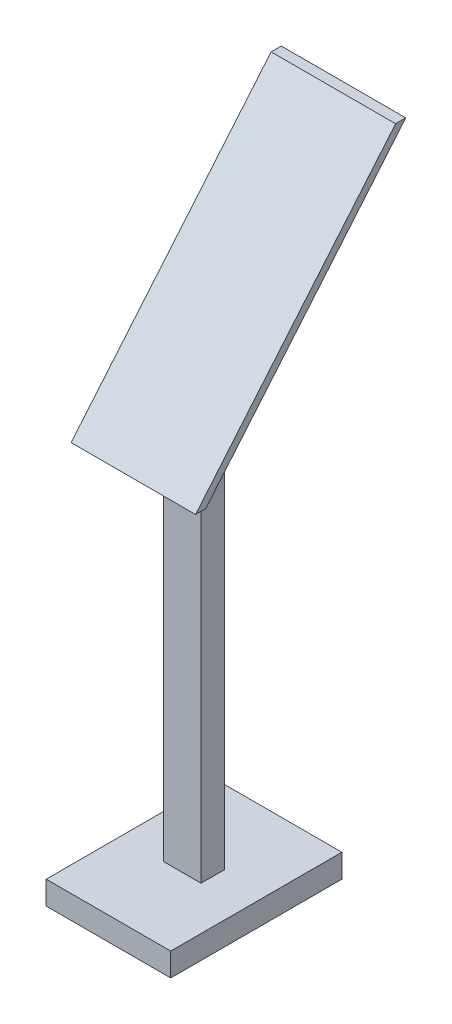
ISO-10303-21;
HEADER;
FILE_DESCRIPTION(('STEP AP214'),'2;1');
FILE_NAME('part.step','',(''),(''),'','','');
FILE_SCHEMA(('AUTOMOTIVE_DESIGN { 1 0 10303 214 1 1 1 1 }'));
ENDSEC;
DATA;
#1=APPLICATION_CONTEXT('core data for automotive mechanical design processes');
#2=APPLICATION_PROTOCOL_DEFINITION('international standard','automotive_design',2000,#1);
#3=PRODUCT_CONTEXT('',#1,'mechanical');
#4=PRODUCT('Part','Part','',(#3));
#5=PRODUCT_RELATED_PRODUCT_CATEGORY('part','',(#4));
#6=PRODUCT_DEFINITION_FORMATION('','',#4);
#7=PRODUCT_DEFINITION_CONTEXT('part definition',#1,'design');
#8=PRODUCT_DEFINITION('design','',#6,#7);
#9=PRODUCT_DEFINITION_SHAPE('','',#8);
#10=(LENGTH_UNIT() NAMED_UNIT(*) SI_UNIT(.MILLI.,.METRE.));
#11=(NAMED_UNIT(*) PLANE_ANGLE_UNIT() SI_UNIT($,.RADIAN.));
#12=(NAMED_UNIT(*) SI_UNIT($,.STERADIAN.) SOLID_ANGLE_UNIT());
#13=UNCERTAINTY_MEASURE_WITH_UNIT(LENGTH_MEASURE(1.E-05),#10,'distance_accuracy_value','');
#14=(GEOMETRIC_REPRESENTATION_CONTEXT(3) GLOBAL_UNCERTAINTY_ASSIGNED_CONTEXT((#13)) GLOBAL_UNIT_ASSIGNED_CONTEXT((#10,
#11,#12)) REPRESENTATION_CONTEXT('',''));
#15=CARTESIAN_POINT('',(0.,0.,0.));
#16=DIRECTION('',(0.,0.,1.));
#17=DIRECTION('',(1.,0.,0.));
#18=AXIS2_PLACEMENT_3D('',#15,#16,#17);
#19=CARTESIAN_POINT('',(-40.,0.,0.));
#20=DIRECTION('',(1.,0.,0.));
#21=DIRECTION('',(0.,0.,-1.));
#22=AXIS2_PLACEMENT_3D('',#19,#20,#21);
#23=PLANE('',#22);
#24=DIRECTION('',(0.,-1.,0.));
#25=VECTOR('',#24,1.);
#26=CARTESIAN_POINT('',(-40.,0.,55.));
#27=LINE('',#26,#25);
#28=CARTESIAN_POINT('',(-40.,15.,55.));
#29=VERTEX_POINT('',#28);
#30=CARTESIAN_POINT('',(-40.,0.,55.));
#31=VERTEX_POINT('',#30);
#32=EDGE_CURVE('E140',#29,#31,#27,.T.);
#33=ORIENTED_EDGE('',*,*,#32,.F.);
#34=DIRECTION('',(0.,0.,1.));
#35=VECTOR('',#34,1.);
#36=CARTESIAN_POINT('',(-40.,15.,-55.));
#37=LINE('',#36,#35);
#38=CARTESIAN_POINT('',(-40.,15.,-55.));
#39=VERTEX_POINT('',#38);
#40=EDGE_CURVE('E147',#39,#29,#37,.T.);
#41=ORIENTED_EDGE('',*,*,#40,.F.);
#42=DIRECTION('',(0.,1.,0.));
#43=VECTOR('',#42,1.);
#44=CARTESIAN_POINT('',(-40.,0.,-55.));
#45=LINE('',#44,#43);
#46=CARTESIAN_POINT('',(-40.,0.,-55.));
#47=VERTEX_POINT('',#46);
#48=EDGE_CURVE('E145',#47,#39,#45,.T.);
#49=ORIENTED_EDGE('',*,*,#48,.F.);
#50=DIRECTION('',(0.,0.,-1.));
#51=VECTOR('',#50,1.);
#52=CARTESIAN_POINT('',(-40.,0.,-55.));
#53=LINE('',#52,#51);
#54=EDGE_CURVE('E142',#31,#47,#53,.T.);
#55=ORIENTED_EDGE('',*,*,#54,.F.);
#56=EDGE_LOOP('',(#33,#41,#49,#55));
#57=FACE_BOUND('',#56,.T.);
#58=ADVANCED_FACE('F39',(#57),#23,.F.);
#59=DIRECTION('',(0.,0.,1.));
#60=VECTOR('',#59,1.);
#61=CARTESIAN_POINT('',(-40.,403.208888623795,-89.5304854906467));
#62=LINE('',#61,#60);
#63=CARTESIAN_POINT('',(-40.,403.208888623795,-96.0575219373081));
#64=VERTEX_POINT('',#63);
#65=CARTESIAN_POINT('',(-40.,403.208888623795,-89.5304854906467));
#66=VERTEX_POINT('',#65);
#67=EDGE_CURVE('E128',#64,#66,#62,.T.);
#68=ORIENTED_EDGE('',*,*,#67,.F.);
#69=DIRECTION('',(0.,0.766044443118977,-0.64278760968654));
#70=VECTOR('',#69,1.);
#71=CARTESIAN_POINT('',(-40.,250.,32.5));
#72=LINE('',#71,#70);
#73=CARTESIAN_POINT('',(-40.,250.,32.5));
#74=VERTEX_POINT('',#73);
#75=EDGE_CURVE('E152',#74,#64,#72,.T.);
#76=ORIENTED_EDGE('',*,*,#75,.F.);
#77=DIRECTION('',(0.,0.,-1.));
#78=VECTOR('',#77,1.);
#79=CARTESIAN_POINT('',(-40.,250.,39.0270364466614));
#80=LINE('',#79,#78);
#81=CARTESIAN_POINT('',(-40.,250.,39.0270364466614));
#82=VERTEX_POINT('',#81);
#83=EDGE_CURVE('E94',#82,#74,#80,.T.);
#84=ORIENTED_EDGE('',*,*,#83,.F.);
#85=DIRECTION('',(0.,-0.766044443118977,0.64278760968654));
#86=VECTOR('',#85,1.);
#87=CARTESIAN_POINT('',(-40.,403.208888623795,-89.5304854906467));
#88=LINE('',#87,#86);
#89=EDGE_CURVE('E87',#66,#82,#88,.T.);
#90=ORIENTED_EDGE('',*,*,#89,.F.);
#91=EDGE_LOOP('',(#68,#76,#84,#90));
#92=FACE_BOUND('',#91,.T.);
#93=ADVANCED_FACE('F269',(#92),#23,.F.);
#94=CARTESIAN_POINT('',(40.,0.,0.));
#95=DIRECTION('',(1.,0.,0.));
#96=DIRECTION('',(0.,0.,-1.));
#97=AXIS2_PLACEMENT_3D('',#94,#95,#96);
#98=PLANE('',#97);
#99=DIRECTION('',(0.,0.,-1.));
#100=VECTOR('',#99,1.);
#101=CARTESIAN_POINT('',(40.,250.,39.0270364466614));
#102=LINE('',#101,#100);
#103=CARTESIAN_POINT('',(40.,250.,39.0270364466614));
#104=VERTEX_POINT('',#103);
#105=CARTESIAN_POINT('',(40.,250.,32.5));
#106=VERTEX_POINT('',#105);
#107=EDGE_CURVE('E134',#104,#106,#102,.T.);
#108=ORIENTED_EDGE('',*,*,#107,.T.);
#109=DIRECTION('',(0.,0.766044443118977,-0.64278760968654));
#110=VECTOR('',#109,1.);
#111=CARTESIAN_POINT('',(40.,297.670143703768,-7.5));
#112=LINE('',#111,#110);
#113=CARTESIAN_POINT('',(40.,403.208888623795,-96.0575219373081));
#114=VERTEX_POINT('',#113);
#115=EDGE_CURVE('E56',#106,#114,#112,.T.);
#116=ORIENTED_EDGE('',*,*,#115,.T.);
#117=DIRECTION('',(0.,0.,1.));
#118=VECTOR('',#117,1.);
#119=CARTESIAN_POINT('',(40.,403.208888623795,-89.5304854906467));
#120=LINE('',#119,#118);
#121=CARTESIAN_POINT('',(40.,403.208888623795,-89.5304854906467));
#122=VERTEX_POINT('',#121);
#123=EDGE_CURVE('E117',#114,#122,#120,.T.);
#124=ORIENTED_EDGE('',*,*,#123,.T.);
#125=DIRECTION('',(0.,-0.766044443118977,0.64278760968654));
#126=VECTOR('',#125,1.);
#127=CARTESIAN_POINT('',(40.,403.208888623795,-89.5304854906467));
#128=LINE('',#127,#126);
#129=EDGE_CURVE('E121',#122,#104,#128,.T.);
#130=ORIENTED_EDGE('',*,*,#129,.T.);
#131=EDGE_LOOP('',(#108,#116,#124,#130));
#132=FACE_BOUND('',#131,.T.);
#133=ADVANCED_FACE('F119',(#132),#98,.T.);
#134=CARTESIAN_POINT('',(40.,0.,55.));
#135=DIRECTION('',(0.,0.,-1.));
#136=DIRECTION('',(0.,1.,0.));
#137=AXIS2_PLACEMENT_3D('',#134,#135,#136);
#138=PLANE('',#137);
#139=ORIENTED_EDGE('',*,*,#32,.T.);
#140=DIRECTION('',(-1.,0.,0.));
#141=VECTOR('',#140,1.);
#142=CARTESIAN_POINT('',(40.,0.,55.));
#143=LINE('',#142,#141);
#144=CARTESIAN_POINT('',(40.,0.,55.));
#145=VERTEX_POINT('',#144);
#146=EDGE_CURVE('E48',#145,#31,#143,.T.);
#147=ORIENTED_EDGE('',*,*,#146,.F.);
#148=DIRECTION('',(0.,-1.,0.));
#149=VECTOR('',#148,1.);
#150=CARTESIAN_POINT('',(40.,0.,55.));
#151=LINE('',#150,#149);
#152=CARTESIAN_POINT('',(40.,15.,55.));
#153=VERTEX_POINT('',#152);
#154=EDGE_CURVE('E101',#153,#145,#151,.T.);
#155=ORIENTED_EDGE('',*,*,#154,.F.);
#156=DIRECTION('',(-1.,0.,0.));
#157=VECTOR('',#156,1.);
#158=CARTESIAN_POINT('',(40.,15.,55.));
#159=LINE('',#158,#157);
#160=EDGE_CURVE('E11',#153,#29,#159,.T.);
#161=ORIENTED_EDGE('',*,*,#160,.T.);
#162=EDGE_LOOP('',(#139,#147,#155,#161));
#163=FACE_BOUND('',#162,.T.);
#164=ADVANCED_FACE('F41',(#163),#138,.F.);
#165=CARTESIAN_POINT('',(40.,0.,-55.));
#166=DIRECTION('',(0.,1.,0.));
#167=DIRECTION('',(0.,0.,1.));
#168=AXIS2_PLACEMENT_3D('',#165,#166,#167);
#169=PLANE('',#168);
#170=ORIENTED_EDGE('',*,*,#54,.T.);
#171=DIRECTION('',(-1.,0.,0.));
#172=VECTOR('',#171,1.);
#173=CARTESIAN_POINT('',(40.,0.,-55.));
#174=LINE('',#173,#172);
#175=CARTESIAN_POINT('',(40.,0.,-55.));
#176=VERTEX_POINT('',#175);
#177=EDGE_CURVE('E173',#176,#47,#174,.T.);
#178=ORIENTED_EDGE('',*,*,#177,.F.);
#179=DIRECTION('',(0.,0.,-1.));
#180=VECTOR('',#179,1.);
#181=CARTESIAN_POINT('',(40.,0.,-55.));
#182=LINE('',#181,#180);
#183=EDGE_CURVE('E181',#145,#176,#182,.T.);
#184=ORIENTED_EDGE('',*,*,#183,.F.);
#185=ORIENTED_EDGE('',*,*,#146,.T.);
#186=EDGE_LOOP('',(#170,#178,#184,#185));
#187=FACE_BOUND('',#186,.T.);
#188=ADVANCED_FACE('F179',(#187),#169,.F.);
#189=CARTESIAN_POINT('',(40.,0.,-55.));
#190=DIRECTION('',(0.,0.,1.));
#191=DIRECTION('',(0.,-1.,0.));
#192=AXIS2_PLACEMENT_3D('',#189,#190,#191);
#193=PLANE('',#192);
#194=ORIENTED_EDGE('',*,*,#48,.T.);
#195=DIRECTION('',(-1.,0.,0.));
#196=VECTOR('',#195,1.);
#197=CARTESIAN_POINT('',(40.,15.,-55.));
#198=LINE('',#197,#196);
#199=CARTESIAN_POINT('',(40.,15.,-55.));
#200=VERTEX_POINT('',#199);
#201=EDGE_CURVE('E170',#200,#39,#198,.T.);
#202=ORIENTED_EDGE('',*,*,#201,.F.);
#203=DIRECTION('',(0.,1.,0.));
#204=VECTOR('',#203,1.);
#205=CARTESIAN_POINT('',(40.,0.,-55.));
#206=LINE('',#205,#204);
#207=EDGE_CURVE('E197',#176,#200,#206,.T.);
#208=ORIENTED_EDGE('',*,*,#207,.F.);
#209=ORIENTED_EDGE('',*,*,#177,.T.);
#210=EDGE_LOOP('',(#194,#202,#208,#209));
#211=FACE_BOUND('',#210,.T.);
#212=ADVANCED_FACE('F188',(#211),#193,.F.);
#213=CARTESIAN_POINT('',(40.,15.,-55.));
#214=DIRECTION('',(0.,-1.,0.));
#215=DIRECTION('',(0.,0.,-1.));
#216=AXIS2_PLACEMENT_3D('',#213,#214,#215);
#217=PLANE('',#216);
#218=ORIENTED_EDGE('',*,*,#40,.T.);
#219=ORIENTED_EDGE('',*,*,#160,.F.);
#220=DIRECTION('',(0.,0.,1.));
#221=VECTOR('',#220,1.);
#222=CARTESIAN_POINT('',(40.,15.,55.));
#223=LINE('',#222,#221);
#224=EDGE_CURVE('E154',#200,#153,#223,.T.);
#225=ORIENTED_EDGE('',*,*,#224,.F.);
#226=ORIENTED_EDGE('',*,*,#201,.T.);
#227=EDGE_LOOP('',(#218,#219,#225,#226));
#228=FACE_BOUND('',#227,.T.);
#229=DIRECTION('',(0.,0.,-1.));
#230=VECTOR('',#229,1.);
#231=CARTESIAN_POINT('',(-12.,15.,-7.5));
#232=LINE('',#231,#230);
#233=CARTESIAN_POINT('',(-12.,15.,7.5));
#234=VERTEX_POINT('',#233);
#235=CARTESIAN_POINT('',(-12.,15.,-7.5));
#236=VERTEX_POINT('',#235);
#237=EDGE_CURVE('E214',#234,#236,#232,.T.);
#238=ORIENTED_EDGE('',*,*,#237,.T.);
#239=DIRECTION('',(-1.,0.,0.));
#240=VECTOR('',#239,1.);
#241=CARTESIAN_POINT('',(40.,15.,-7.5));
#242=LINE('',#241,#240);
#243=CARTESIAN_POINT('',(12.,15.,-7.5));
#244=VERTEX_POINT('',#243);
#245=EDGE_CURVE('E167',#244,#236,#242,.T.);
#246=ORIENTED_EDGE('',*,*,#245,.F.);
#247=DIRECTION('',(0.,0.,-1.));
#248=VECTOR('',#247,1.);
#249=CARTESIAN_POINT('',(12.,15.,-7.5));
#250=LINE('',#249,#248);
#251=CARTESIAN_POINT('',(12.,15.,7.5));
#252=VERTEX_POINT('',#251);
#253=EDGE_CURVE('E208',#252,#244,#250,.T.);
#254=ORIENTED_EDGE('',*,*,#253,.F.);
#255=DIRECTION('',(-1.,0.,0.));
#256=VECTOR('',#255,1.);
#257=CARTESIAN_POINT('',(40.,15.,7.5));
#258=LINE('',#257,#256);
#259=EDGE_CURVE('E136',#252,#234,#258,.T.);
#260=ORIENTED_EDGE('',*,*,#259,.T.);
#261=EDGE_LOOP('',(#238,#246,#254,#260));
#262=FACE_BOUND('',#261,.T.);
#263=ADVANCED_FACE('F191',(#228,#262),#217,.F.);
#264=CARTESIAN_POINT('',(40.,15.,-7.5));
#265=DIRECTION('',(0.,0.,1.));
#266=DIRECTION('',(1.,0.,0.));
#267=AXIS2_PLACEMENT_3D('',#264,#265,#266);
#268=PLANE('',#267);
#269=ORIENTED_EDGE('',*,*,#245,.T.);
#270=DIRECTION('',(0.,1.,0.));
#271=VECTOR('',#270,1.);
#272=CARTESIAN_POINT('',(-12.,297.670143703768,-7.5));
#273=LINE('',#272,#271);
#274=CARTESIAN_POINT('',(-12.,297.670143703768,-7.5));
#275=VERTEX_POINT('',#274);
#276=EDGE_CURVE('E217',#236,#275,#273,.T.);
#277=ORIENTED_EDGE('',*,*,#276,.T.);
#278=DIRECTION('',(-1.,0.,0.));
#279=VECTOR('',#278,1.);
#280=CARTESIAN_POINT('',(40.,297.670143703768,-7.5));
#281=LINE('',#280,#279);
#282=CARTESIAN_POINT('',(12.,297.670143703768,-7.5));
#283=VERTEX_POINT('',#282);
#284=EDGE_CURVE('E164',#283,#275,#281,.T.);
#285=ORIENTED_EDGE('',*,*,#284,.F.);
#286=DIRECTION('',(0.,1.,0.));
#287=VECTOR('',#286,1.);
#288=CARTESIAN_POINT('',(12.,297.670143703768,-7.5));
#289=LINE('',#288,#287);
#290=EDGE_CURVE('E205',#244,#283,#289,.T.);
#291=ORIENTED_EDGE('',*,*,#290,.F.);
#292=EDGE_LOOP('',(#269,#277,#285,#291));
#293=FACE_BOUND('',#292,.T.);
#294=ADVANCED_FACE('F257',(#293),#268,.F.);
#295=CARTESIAN_POINT('',(40.,403.208888623795,-89.5304854906467));
#296=DIRECTION('',(0.,-1.,0.));
#297=DIRECTION('',(0.,0.,-1.));
#298=AXIS2_PLACEMENT_3D('',#295,#296,#297);
#299=PLANE('',#298);
#300=ORIENTED_EDGE('',*,*,#67,.T.);
#301=DIRECTION('',(-1.,0.,0.));
#302=VECTOR('',#301,1.);
#303=CARTESIAN_POINT('',(40.,403.208888623795,-89.5304854906467));
#304=LINE('',#303,#302);
#305=EDGE_CURVE('E125',#122,#66,#304,.T.);
#306=ORIENTED_EDGE('',*,*,#305,.F.);
#307=ORIENTED_EDGE('',*,*,#123,.F.);
#308=DIRECTION('',(-1.,0.,0.));
#309=VECTOR('',#308,1.);
#310=CARTESIAN_POINT('',(40.,403.208888623795,-96.0575219373081));
#311=LINE('',#310,#309);
#312=EDGE_CURVE('E129',#114,#64,#311,.T.);
#313=ORIENTED_EDGE('',*,*,#312,.T.);
#314=EDGE_LOOP('',(#300,#306,#307,#313));
#315=FACE_BOUND('',#314,.T.);
#316=ADVANCED_FACE('F126',(#315),#299,.F.);
#317=CARTESIAN_POINT('',(40.,403.208888623795,-89.5304854906467));
#318=DIRECTION('',(0.,-0.64278760968654,-0.766044443118977));
#319=DIRECTION('',(0.,0.766044443118977,-0.64278760968654));
#320=AXIS2_PLACEMENT_3D('',#317,#318,#319);
#321=PLANE('',#320);
#322=ORIENTED_EDGE('',*,*,#89,.T.);
#323=DIRECTION('',(-1.,0.,0.));
#324=VECTOR('',#323,1.);
#325=CARTESIAN_POINT('',(40.,250.,39.0270364466614));
#326=LINE('',#325,#324);
#327=EDGE_CURVE('E130',#104,#82,#326,.T.);
#328=ORIENTED_EDGE('',*,*,#327,.F.);
#329=ORIENTED_EDGE('',*,*,#129,.F.);
#330=ORIENTED_EDGE('',*,*,#305,.T.);
#331=EDGE_LOOP('',(#322,#328,#329,#330));
#332=FACE_BOUND('',#331,.T.);
#333=ADVANCED_FACE('F132',(#332),#321,.F.);
#334=CARTESIAN_POINT('',(40.,250.,39.0270364466614));
#335=DIRECTION('',(0.,1.,0.));
#336=DIRECTION('',(0.,0.,1.));
#337=AXIS2_PLACEMENT_3D('',#334,#335,#336);
#338=PLANE('',#337);
#339=ORIENTED_EDGE('',*,*,#83,.T.);
#340=DIRECTION('',(-1.,0.,0.));
#341=VECTOR('',#340,1.);
#342=CARTESIAN_POINT('',(40.,250.,32.5));
#343=LINE('',#342,#341);
#344=EDGE_CURVE('E160',#106,#74,#343,.T.);
#345=ORIENTED_EDGE('',*,*,#344,.F.);
#346=ORIENTED_EDGE('',*,*,#107,.F.);
#347=ORIENTED_EDGE('',*,*,#327,.T.);
#348=EDGE_LOOP('',(#339,#345,#346,#347));
#349=FACE_BOUND('',#348,.T.);
#350=ADVANCED_FACE('F282',(#349),#338,.F.);
#351=CARTESIAN_POINT('',(40.,250.,32.5));
#352=DIRECTION('',(0.,0.64278760968654,0.766044443118977));
#353=DIRECTION('',(0.,-0.766044443118977,0.64278760968654));
#354=AXIS2_PLACEMENT_3D('',#351,#352,#353);
#355=PLANE('',#354);
#356=ORIENTED_EDGE('',*,*,#75,.T.);
#357=ORIENTED_EDGE('',*,*,#312,.F.);
#358=ORIENTED_EDGE('',*,*,#115,.F.);
#359=ORIENTED_EDGE('',*,*,#344,.T.);
#360=EDGE_LOOP('',(#356,#357,#358,#359));
#361=FACE_BOUND('',#360,.T.);
#362=ORIENTED_EDGE('',*,*,#284,.T.);
#363=DIRECTION('',(0.,-0.766044443118977,0.642787609686541));
#364=VECTOR('',#363,1.);
#365=CARTESIAN_POINT('',(-12.,279.793839814855,7.5));
#366=LINE('',#365,#364);
#367=CARTESIAN_POINT('',(-12.,279.793839814855,7.5));
#368=VERTEX_POINT('',#367);
#369=EDGE_CURVE('E220',#275,#368,#366,.T.);
#370=ORIENTED_EDGE('',*,*,#369,.T.);
#371=DIRECTION('',(-1.,0.,0.));
#372=VECTOR('',#371,1.);
#373=CARTESIAN_POINT('',(40.,279.793839814855,7.5));
#374=LINE('',#373,#372);
#375=CARTESIAN_POINT('',(12.,279.793839814855,7.5));
#376=VERTEX_POINT('',#375);
#377=EDGE_CURVE('E157',#376,#368,#374,.T.);
#378=ORIENTED_EDGE('',*,*,#377,.F.);
#379=DIRECTION('',(0.,-0.766044443118977,0.642787609686541));
#380=VECTOR('',#379,1.);
#381=CARTESIAN_POINT('',(12.,279.793839814855,7.5));
#382=LINE('',#381,#380);
#383=EDGE_CURVE('E143',#283,#376,#382,.T.);
#384=ORIENTED_EDGE('',*,*,#383,.F.);
#385=EDGE_LOOP('',(#362,#370,#378,#384));
#386=FACE_BOUND('',#385,.T.);
#387=ADVANCED_FACE('F250',(#361,#386),#355,.F.);
#388=CARTESIAN_POINT('',(40.,15.,7.5));
#389=DIRECTION('',(0.,0.,-1.));
#390=DIRECTION('',(-1.,0.,0.));
#391=AXIS2_PLACEMENT_3D('',#388,#389,#390);
#392=PLANE('',#391);
#393=ORIENTED_EDGE('',*,*,#377,.T.);
#394=DIRECTION('',(0.,-1.,0.));
#395=VECTOR('',#394,1.);
#396=CARTESIAN_POINT('',(-12.,279.793839814855,7.5));
#397=LINE('',#396,#395);
#398=EDGE_CURVE('E223',#368,#234,#397,.T.);
#399=ORIENTED_EDGE('',*,*,#398,.T.);
#400=ORIENTED_EDGE('',*,*,#259,.F.);
#401=DIRECTION('',(0.,-1.,0.));
#402=VECTOR('',#401,1.);
#403=CARTESIAN_POINT('',(12.,279.793839814855,7.5));
#404=LINE('',#403,#402);
#405=EDGE_CURVE('E211',#376,#252,#404,.T.);
#406=ORIENTED_EDGE('',*,*,#405,.F.);
#407=EDGE_LOOP('',(#393,#399,#400,#406));
#408=FACE_BOUND('',#407,.T.);
#409=ADVANCED_FACE('F229',(#408),#392,.F.);
#410=ORIENTED_EDGE('',*,*,#207,.T.);
#411=ORIENTED_EDGE('',*,*,#224,.T.);
#412=ORIENTED_EDGE('',*,*,#154,.T.);
#413=ORIENTED_EDGE('',*,*,#183,.T.);
#414=EDGE_LOOP('',(#410,#411,#412,#413));
#415=FACE_BOUND('',#414,.T.);
#416=ADVANCED_FACE('F198',(#415),#98,.T.);
#417=CARTESIAN_POINT('',(12.,0.,0.));
#418=DIRECTION('',(-1.,0.,0.));
#419=DIRECTION('',(0.,0.,1.));
#420=AXIS2_PLACEMENT_3D('',#417,#418,#419);
#421=PLANE('',#420);
#422=ORIENTED_EDGE('',*,*,#405,.T.);
#423=ORIENTED_EDGE('',*,*,#253,.T.);
#424=ORIENTED_EDGE('',*,*,#290,.T.);
#425=ORIENTED_EDGE('',*,*,#383,.T.);
#426=EDGE_LOOP('',(#422,#423,#424,#425));
#427=FACE_BOUND('',#426,.T.);
#428=ADVANCED_FACE('F246',(#427),#421,.F.);
#429=CARTESIAN_POINT('',(-12.,0.,0.));
#430=DIRECTION('',(1.,0.,0.));
#431=DIRECTION('',(0.,0.,1.));
#432=AXIS2_PLACEMENT_3D('',#429,#430,#431);
#433=PLANE('',#432);
#434=ORIENTED_EDGE('',*,*,#398,.F.);
#435=ORIENTED_EDGE('',*,*,#369,.F.);
#436=ORIENTED_EDGE('',*,*,#276,.F.);
#437=ORIENTED_EDGE('',*,*,#237,.F.);
#438=EDGE_LOOP('',(#434,#435,#436,#437));
#439=FACE_BOUND('',#438,.T.);
#440=ADVANCED_FACE('F254',(#439),#433,.F.);
#441=CLOSED_SHELL('',(#58,#93,#133,#164,#188,#212,#263,#294,#316,#333,#350,#387,#409,#416,#428,#440));
#442=MANIFOLD_SOLID_BREP('B2',#441);
#443=ADVANCED_BREP_SHAPE_REPRESENTATION('',(#18,#442),#14);
#444=SHAPE_DEFINITION_REPRESENTATION(#9,#443);
ENDSEC;
END-ISO-10303-21;
